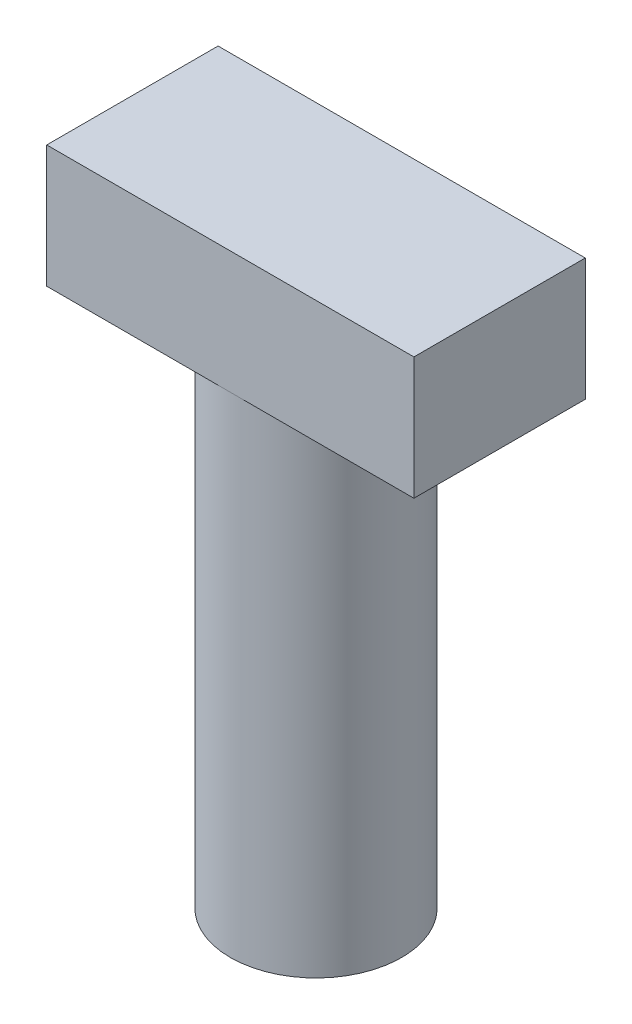
ISO-10303-21;
HEADER;
FILE_DESCRIPTION(('STEP AP214'),'2;1');
FILE_NAME('part.step','',(''),(''),'','','');
FILE_SCHEMA(('AUTOMOTIVE_DESIGN { 1 0 10303 214 1 1 1 1 }'));
ENDSEC;
DATA;
#1=APPLICATION_CONTEXT('core data for automotive mechanical design processes');
#2=APPLICATION_PROTOCOL_DEFINITION('international standard','automotive_design',2000,#1);
#3=PRODUCT_CONTEXT('',#1,'mechanical');
#4=PRODUCT('Part','Part','',(#3));
#5=PRODUCT_RELATED_PRODUCT_CATEGORY('part','',(#4));
#6=PRODUCT_DEFINITION_FORMATION('','',#4);
#7=PRODUCT_DEFINITION_CONTEXT('part definition',#1,'design');
#8=PRODUCT_DEFINITION('design','',#6,#7);
#9=PRODUCT_DEFINITION_SHAPE('','',#8);
#10=(LENGTH_UNIT() NAMED_UNIT(*) SI_UNIT(.MILLI.,.METRE.));
#11=(NAMED_UNIT(*) PLANE_ANGLE_UNIT() SI_UNIT($,.RADIAN.));
#12=(NAMED_UNIT(*) SI_UNIT($,.STERADIAN.) SOLID_ANGLE_UNIT());
#13=UNCERTAINTY_MEASURE_WITH_UNIT(LENGTH_MEASURE(1.E-05),#10,'distance_accuracy_value','');
#14=(GEOMETRIC_REPRESENTATION_CONTEXT(3) GLOBAL_UNCERTAINTY_ASSIGNED_CONTEXT((#13)) GLOBAL_UNIT_ASSIGNED_CONTEXT((#10,
#11,#12)) REPRESENTATION_CONTEXT('',''));
#15=CARTESIAN_POINT('',(0.,0.,0.));
#16=DIRECTION('',(0.,0.,1.));
#17=DIRECTION('',(1.,0.,0.));
#18=AXIS2_PLACEMENT_3D('',#15,#16,#17);
#19=CARTESIAN_POINT('',(0.,40.,0.));
#20=DIRECTION('',(0.,-1.,0.));
#21=DIRECTION('',(0.,0.,-1.));
#22=AXIS2_PLACEMENT_3D('',#19,#20,#21);
#23=CYLINDRICAL_SURFACE('',#22,7.);
#24=CARTESIAN_POINT('',(0.,40.,0.));
#25=DIRECTION('',(0.,1.,0.));
#26=DIRECTION('',(0.,0.,1.));
#27=AXIS2_PLACEMENT_3D('',#24,#25,#26);
#28=CIRCLE('',#27,7.);
#29=CARTESIAN_POINT('',(0.,40.,7.));
#30=VERTEX_POINT('',#29);
#31=CARTESIAN_POINT('',(0.,40.,-7.));
#32=VERTEX_POINT('',#31);
#33=EDGE_CURVE('E11',#30,#32,#28,.T.);
#34=ORIENTED_EDGE('',*,*,#33,.F.);
#35=EDGE_CURVE('E49',#32,#30,#28,.T.);
#36=ORIENTED_EDGE('',*,*,#35,.F.);
#37=EDGE_LOOP('',(#34,#36));
#38=FACE_BOUND('',#37,.T.);
#39=CARTESIAN_POINT('',(0.,0.,0.));
#40=DIRECTION('',(0.,1.,0.));
#41=DIRECTION('',(0.,0.,1.));
#42=AXIS2_PLACEMENT_3D('',#39,#40,#41);
#43=CIRCLE('',#42,7.);
#44=CARTESIAN_POINT('',(0.,0.,7.));
#45=VERTEX_POINT('',#44);
#46=EDGE_CURVE('E44',#45,#45,#43,.T.);
#47=ORIENTED_EDGE('',*,*,#46,.T.);
#48=EDGE_LOOP('',(#47));
#49=FACE_BOUND('',#48,.T.);
#50=ADVANCED_FACE('F41',(#38,#49),#23,.T.);
#51=CARTESIAN_POINT('',(0.,0.,0.));
#52=DIRECTION('',(0.,1.,0.));
#53=DIRECTION('',(0.,0.,1.));
#54=AXIS2_PLACEMENT_3D('',#51,#52,#53);
#55=PLANE('',#54);
#56=ORIENTED_EDGE('',*,*,#46,.F.);
#57=EDGE_LOOP('',(#56));
#58=FACE_BOUND('',#57,.T.);
#59=ADVANCED_FACE('F141',(#58),#55,.F.);
#60=CARTESIAN_POINT('',(0.,40.,0.));
#61=DIRECTION('',(0.,1.,0.));
#62=DIRECTION('',(0.,0.,1.));
#63=AXIS2_PLACEMENT_3D('',#60,#61,#62);
#64=PLANE('',#63);
#65=DIRECTION('',(1.,0.,0.));
#66=VECTOR('',#65,1.);
#67=CARTESIAN_POINT('',(-15.,40.,7.));
#68=LINE('',#67,#66);
#69=CARTESIAN_POINT('',(15.,40.,7.));
#70=VERTEX_POINT('',#69);
#71=EDGE_CURVE('E124',#30,#70,#68,.T.);
#72=ORIENTED_EDGE('',*,*,#71,.F.);
#73=ORIENTED_EDGE('',*,*,#33,.T.);
#74=DIRECTION('',(-1.,0.,0.));
#75=VECTOR('',#74,1.);
#76=CARTESIAN_POINT('',(-15.,40.,-7.));
#77=LINE('',#76,#75);
#78=CARTESIAN_POINT('',(15.,40.,-7.));
#79=VERTEX_POINT('',#78);
#80=EDGE_CURVE('E103',#79,#32,#77,.T.);
#81=ORIENTED_EDGE('',*,*,#80,.F.);
#82=DIRECTION('',(0.,0.,-1.));
#83=VECTOR('',#82,1.);
#84=CARTESIAN_POINT('',(15.,40.,-7.));
#85=LINE('',#84,#83);
#86=EDGE_CURVE('E120',#70,#79,#85,.T.);
#87=ORIENTED_EDGE('',*,*,#86,.F.);
#88=EDGE_LOOP('',(#72,#73,#81,#87));
#89=FACE_BOUND('',#88,.T.);
#90=ADVANCED_FACE('F139',(#89),#64,.F.);
#91=CARTESIAN_POINT('',(-15.,40.,-7.));
#92=VERTEX_POINT('',#91);
#93=EDGE_CURVE('E119',#32,#92,#77,.T.);
#94=ORIENTED_EDGE('',*,*,#93,.F.);
#95=ORIENTED_EDGE('',*,*,#35,.T.);
#96=CARTESIAN_POINT('',(-15.,40.,7.));
#97=VERTEX_POINT('',#96);
#98=EDGE_CURVE('E122',#97,#30,#68,.T.);
#99=ORIENTED_EDGE('',*,*,#98,.F.);
#100=DIRECTION('',(0.,0.,1.));
#101=VECTOR('',#100,1.);
#102=CARTESIAN_POINT('',(-15.,40.,-7.));
#103=LINE('',#102,#101);
#104=EDGE_CURVE('E107',#92,#97,#103,.T.);
#105=ORIENTED_EDGE('',*,*,#104,.F.);
#106=EDGE_LOOP('',(#94,#95,#99,#105));
#107=FACE_BOUND('',#106,.T.);
#108=ADVANCED_FACE('F136',(#107),#64,.F.);
#109=CARTESIAN_POINT('',(-15.,50.,-7.));
#110=DIRECTION('',(1.,0.,0.));
#111=DIRECTION('',(0.,0.,-1.));
#112=AXIS2_PLACEMENT_3D('',#109,#110,#111);
#113=PLANE('',#112);
#114=ORIENTED_EDGE('',*,*,#104,.T.);
#115=DIRECTION('',(0.,-1.,0.));
#116=VECTOR('',#115,1.);
#117=CARTESIAN_POINT('',(-15.,50.,7.));
#118=LINE('',#117,#116);
#119=CARTESIAN_POINT('',(-15.,50.,7.));
#120=VERTEX_POINT('',#119);
#121=EDGE_CURVE('E87',#120,#97,#118,.T.);
#122=ORIENTED_EDGE('',*,*,#121,.F.);
#123=DIRECTION('',(0.,0.,1.));
#124=VECTOR('',#123,1.);
#125=CARTESIAN_POINT('',(-15.,50.,-7.));
#126=LINE('',#125,#124);
#127=CARTESIAN_POINT('',(-15.,50.,-7.));
#128=VERTEX_POINT('',#127);
#129=EDGE_CURVE('E94',#128,#120,#126,.T.);
#130=ORIENTED_EDGE('',*,*,#129,.F.);
#131=DIRECTION('',(0.,-1.,0.));
#132=VECTOR('',#131,1.);
#133=CARTESIAN_POINT('',(-15.,50.,-7.));
#134=LINE('',#133,#132);
#135=EDGE_CURVE('E115',#128,#92,#134,.T.);
#136=ORIENTED_EDGE('',*,*,#135,.T.);
#137=EDGE_LOOP('',(#114,#122,#130,#136));
#138=FACE_BOUND('',#137,.T.);
#139=ADVANCED_FACE('F105',(#138),#113,.F.);
#140=CARTESIAN_POINT('',(-15.,50.,7.));
#141=DIRECTION('',(0.,0.,-1.));
#142=DIRECTION('',(-1.,0.,0.));
#143=AXIS2_PLACEMENT_3D('',#140,#141,#142);
#144=PLANE('',#143);
#145=ORIENTED_EDGE('',*,*,#98,.T.);
#146=ORIENTED_EDGE('',*,*,#71,.T.);
#147=DIRECTION('',(0.,-1.,0.));
#148=VECTOR('',#147,1.);
#149=CARTESIAN_POINT('',(15.,50.,7.));
#150=LINE('',#149,#148);
#151=CARTESIAN_POINT('',(15.,50.,7.));
#152=VERTEX_POINT('',#151);
#153=EDGE_CURVE('E90',#152,#70,#150,.T.);
#154=ORIENTED_EDGE('',*,*,#153,.F.);
#155=DIRECTION('',(1.,0.,0.));
#156=VECTOR('',#155,1.);
#157=CARTESIAN_POINT('',(-15.,50.,7.));
#158=LINE('',#157,#156);
#159=EDGE_CURVE('E82',#120,#152,#158,.T.);
#160=ORIENTED_EDGE('',*,*,#159,.F.);
#161=ORIENTED_EDGE('',*,*,#121,.T.);
#162=EDGE_LOOP('',(#145,#146,#154,#160,#161));
#163=FACE_BOUND('',#162,.T.);
#164=ADVANCED_FACE('F85',(#163),#144,.F.);
#165=CARTESIAN_POINT('',(15.,50.,-7.));
#166=DIRECTION('',(-1.,0.,0.));
#167=DIRECTION('',(0.,0.,1.));
#168=AXIS2_PLACEMENT_3D('',#165,#166,#167);
#169=PLANE('',#168);
#170=ORIENTED_EDGE('',*,*,#86,.T.);
#171=DIRECTION('',(0.,-1.,0.));
#172=VECTOR('',#171,1.);
#173=CARTESIAN_POINT('',(15.,50.,-7.));
#174=LINE('',#173,#172);
#175=CARTESIAN_POINT('',(15.,50.,-7.));
#176=VERTEX_POINT('',#175);
#177=EDGE_CURVE('E110',#176,#79,#174,.T.);
#178=ORIENTED_EDGE('',*,*,#177,.F.);
#179=DIRECTION('',(0.,0.,-1.));
#180=VECTOR('',#179,1.);
#181=CARTESIAN_POINT('',(15.,50.,-7.));
#182=LINE('',#181,#180);
#183=EDGE_CURVE('E93',#152,#176,#182,.T.);
#184=ORIENTED_EDGE('',*,*,#183,.F.);
#185=ORIENTED_EDGE('',*,*,#153,.T.);
#186=EDGE_LOOP('',(#170,#178,#184,#185));
#187=FACE_BOUND('',#186,.T.);
#188=ADVANCED_FACE('F129',(#187),#169,.F.);
#189=CARTESIAN_POINT('',(-15.,50.,-7.));
#190=DIRECTION('',(0.,0.,1.));
#191=DIRECTION('',(1.,0.,0.));
#192=AXIS2_PLACEMENT_3D('',#189,#190,#191);
#193=PLANE('',#192);
#194=ORIENTED_EDGE('',*,*,#80,.T.);
#195=ORIENTED_EDGE('',*,*,#93,.T.);
#196=ORIENTED_EDGE('',*,*,#135,.F.);
#197=DIRECTION('',(-1.,0.,0.));
#198=VECTOR('',#197,1.);
#199=CARTESIAN_POINT('',(-15.,50.,-7.));
#200=LINE('',#199,#198);
#201=EDGE_CURVE('E99',#176,#128,#200,.T.);
#202=ORIENTED_EDGE('',*,*,#201,.F.);
#203=ORIENTED_EDGE('',*,*,#177,.T.);
#204=EDGE_LOOP('',(#194,#195,#196,#202,#203));
#205=FACE_BOUND('',#204,.T.);
#206=ADVANCED_FACE('F133',(#205),#193,.F.);
#207=CARTESIAN_POINT('',(0.,50.,0.));
#208=DIRECTION('',(0.,1.,0.));
#209=DIRECTION('',(0.,0.,1.));
#210=AXIS2_PLACEMENT_3D('',#207,#208,#209);
#211=PLANE('',#210);
#212=ORIENTED_EDGE('',*,*,#129,.T.);
#213=ORIENTED_EDGE('',*,*,#159,.T.);
#214=ORIENTED_EDGE('',*,*,#183,.T.);
#215=ORIENTED_EDGE('',*,*,#201,.T.);
#216=EDGE_LOOP('',(#212,#213,#214,#215));
#217=FACE_BOUND('',#216,.T.);
#218=ADVANCED_FACE('F97',(#217),#211,.T.);
#219=CLOSED_SHELL('',(#50,#59,#90,#108,#139,#164,#188,#206,#218));
#220=MANIFOLD_SOLID_BREP('B2',#219);
#221=ADVANCED_BREP_SHAPE_REPRESENTATION('',(#18,#220),#14);
#222=SHAPE_DEFINITION_REPRESENTATION(#9,#221);
ENDSEC;
END-ISO-10303-21;
